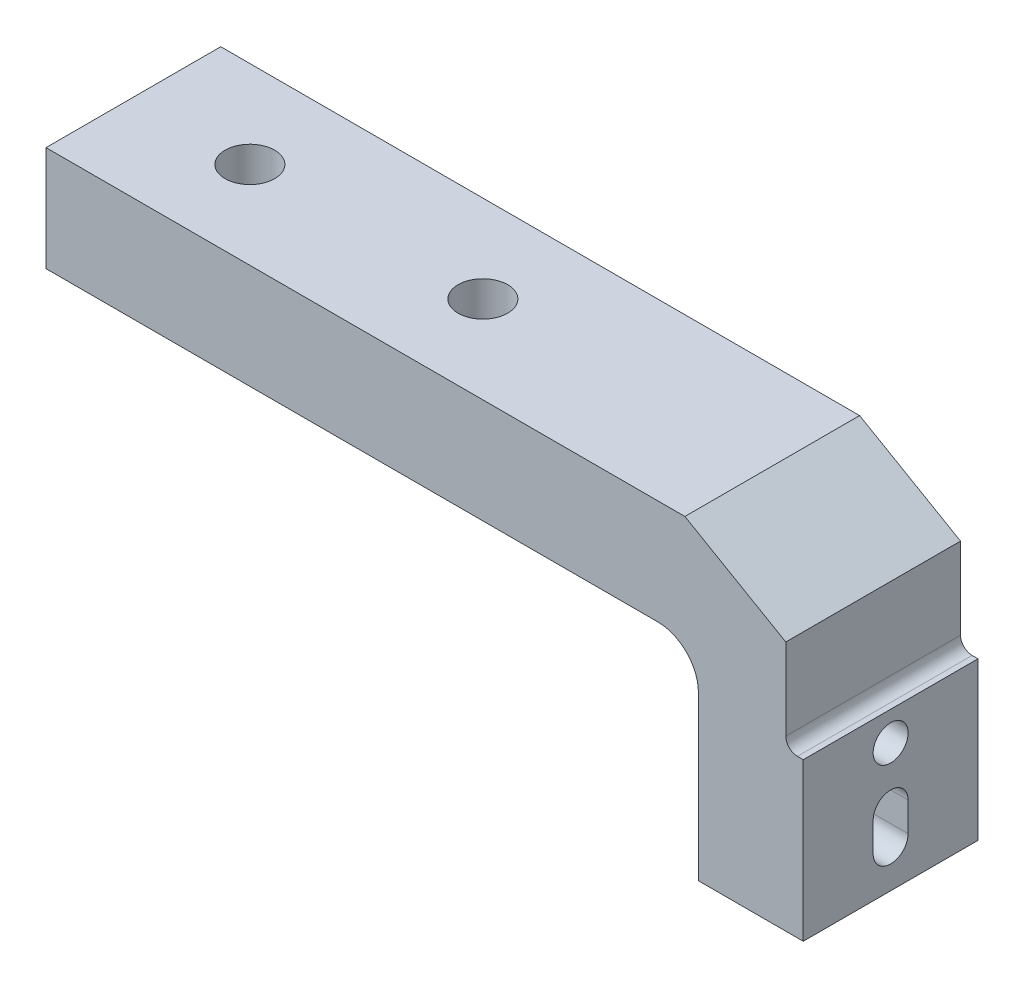
ISO-10303-21;
HEADER;
FILE_DESCRIPTION(('STEP AP214'),'2;1');
FILE_NAME('part.step','',(''),(''),'','','');
FILE_SCHEMA(('AUTOMOTIVE_DESIGN { 1 0 10303 214 1 1 1 1 }'));
ENDSEC;
DATA;
#1=APPLICATION_CONTEXT('core data for automotive mechanical design processes');
#2=APPLICATION_PROTOCOL_DEFINITION('international standard','automotive_design',2000,#1);
#3=PRODUCT_CONTEXT('',#1,'mechanical');
#4=PRODUCT('Part','Part','',(#3));
#5=PRODUCT_RELATED_PRODUCT_CATEGORY('part','',(#4));
#6=PRODUCT_DEFINITION_FORMATION('','',#4);
#7=PRODUCT_DEFINITION_CONTEXT('part definition',#1,'design');
#8=PRODUCT_DEFINITION('design','',#6,#7);
#9=PRODUCT_DEFINITION_SHAPE('','',#8);
#10=(LENGTH_UNIT() NAMED_UNIT(*) SI_UNIT(.MILLI.,.METRE.));
#11=(NAMED_UNIT(*) PLANE_ANGLE_UNIT() SI_UNIT($,.RADIAN.));
#12=(NAMED_UNIT(*) SI_UNIT($,.STERADIAN.) SOLID_ANGLE_UNIT());
#13=UNCERTAINTY_MEASURE_WITH_UNIT(LENGTH_MEASURE(1.E-05),#10,'distance_accuracy_value','');
#14=(GEOMETRIC_REPRESENTATION_CONTEXT(3) GLOBAL_UNCERTAINTY_ASSIGNED_CONTEXT((#13)) GLOBAL_UNIT_ASSIGNED_CONTEXT((#10,
#11,#12)) REPRESENTATION_CONTEXT('',''));
#15=CARTESIAN_POINT('',(0.,0.,0.));
#16=DIRECTION('',(0.,0.,1.));
#17=DIRECTION('',(1.,0.,0.));
#18=AXIS2_PLACEMENT_3D('',#15,#16,#17);
#19=CARTESIAN_POINT('',(-18.,0.,15.));
#20=DIRECTION('',(0.,1.,0.));
#21=DIRECTION('',(0.,0.,1.));
#22=AXIS2_PLACEMENT_3D('',#19,#20,#21);
#23=PLANE('',#22);
#24=DIRECTION('',(1.,0.,0.));
#25=VECTOR('',#24,1.);
#26=CARTESIAN_POINT('',(-18.,0.,-15.));
#27=LINE('',#26,#25);
#28=CARTESIAN_POINT('',(-18.,0.,-15.));
#29=VERTEX_POINT('',#28);
#30=CARTESIAN_POINT('',(0.,0.,-15.));
#31=VERTEX_POINT('',#30);
#32=EDGE_CURVE('E206',#29,#31,#27,.T.);
#33=ORIENTED_EDGE('',*,*,#32,.T.);
#34=DIRECTION('',(0.,0.,-1.));
#35=VECTOR('',#34,1.);
#36=CARTESIAN_POINT('',(0.,0.,15.));
#37=LINE('',#36,#35);
#38=CARTESIAN_POINT('',(0.,0.,15.));
#39=VERTEX_POINT('',#38);
#40=EDGE_CURVE('E235',#39,#31,#37,.T.);
#41=ORIENTED_EDGE('',*,*,#40,.F.);
#42=DIRECTION('',(1.,0.,0.));
#43=VECTOR('',#42,1.);
#44=CARTESIAN_POINT('',(-18.,0.,15.));
#45=LINE('',#44,#43);
#46=CARTESIAN_POINT('',(-18.,0.,15.));
#47=VERTEX_POINT('',#46);
#48=EDGE_CURVE('E186',#47,#39,#45,.T.);
#49=ORIENTED_EDGE('',*,*,#48,.F.);
#50=DIRECTION('',(0.,0.,-1.));
#51=VECTOR('',#50,1.);
#52=CARTESIAN_POINT('',(-18.,0.,15.));
#53=LINE('',#52,#51);
#54=EDGE_CURVE('E205',#47,#29,#53,.T.);
#55=ORIENTED_EDGE('',*,*,#54,.T.);
#56=EDGE_LOOP('',(#33,#41,#49,#55));
#57=FACE_BOUND('',#56,.T.);
#58=ADVANCED_FACE('F35',(#57),#23,.F.);
#59=CARTESIAN_POINT('',(0.,0.,15.));
#60=DIRECTION('',(-1.,0.,0.));
#61=DIRECTION('',(0.,0.,1.));
#62=AXIS2_PLACEMENT_3D('',#59,#60,#61);
#63=PLANE('',#62);
#64=CARTESIAN_POINT('',(0.,22.,0.));
#65=DIRECTION('',(1.,0.,0.));
#66=DIRECTION('',(0.,0.,-1.));
#67=AXIS2_PLACEMENT_3D('',#64,#65,#66);
#68=CIRCLE('',#67,3.);
#69=CARTESIAN_POINT('',(0.,22.,-3.));
#70=VERTEX_POINT('',#69);
#71=EDGE_CURVE('E162',#70,#70,#68,.T.);
#72=ORIENTED_EDGE('',*,*,#71,.F.);
#73=EDGE_LOOP('',(#72));
#74=FACE_BOUND('',#73,.T.);
#75=DIRECTION('',(0.,-1.,0.));
#76=VECTOR('',#75,1.);
#77=CARTESIAN_POINT('',(0.,12.,3.));
#78=LINE('',#77,#76);
#79=CARTESIAN_POINT('',(0.,12.,3.));
#80=VERTEX_POINT('',#79);
#81=CARTESIAN_POINT('',(0.,7.,3.));
#82=VERTEX_POINT('',#81);
#83=EDGE_CURVE('E170',#80,#82,#78,.T.);
#84=ORIENTED_EDGE('',*,*,#83,.F.);
#85=CARTESIAN_POINT('',(0.,12.,0.));
#86=DIRECTION('',(1.,0.,0.));
#87=DIRECTION('',(0.,0.,-1.));
#88=AXIS2_PLACEMENT_3D('',#85,#86,#87);
#89=CIRCLE('',#88,3.);
#90=CARTESIAN_POINT('',(0.,12.,-3.));
#91=VERTEX_POINT('',#90);
#92=EDGE_CURVE('E149',#91,#80,#89,.T.);
#93=ORIENTED_EDGE('',*,*,#92,.F.);
#94=DIRECTION('',(0.,1.,0.));
#95=VECTOR('',#94,1.);
#96=CARTESIAN_POINT('',(0.,12.,-3.));
#97=LINE('',#96,#95);
#98=CARTESIAN_POINT('',(0.,7.,-3.));
#99=VERTEX_POINT('',#98);
#100=EDGE_CURVE('E154',#99,#91,#97,.T.);
#101=ORIENTED_EDGE('',*,*,#100,.F.);
#102=CARTESIAN_POINT('',(0.,7.,0.));
#103=DIRECTION('',(1.,0.,0.));
#104=DIRECTION('',(0.,0.,-1.));
#105=AXIS2_PLACEMENT_3D('',#102,#103,#104);
#106=CIRCLE('',#105,3.);
#107=EDGE_CURVE('E177',#82,#99,#106,.T.);
#108=ORIENTED_EDGE('',*,*,#107,.F.);
#109=EDGE_LOOP('',(#84,#93,#101,#108));
#110=FACE_BOUND('',#109,.T.);
#111=DIRECTION('',(0.,1.,0.));
#112=VECTOR('',#111,1.);
#113=CARTESIAN_POINT('',(0.,0.,-15.));
#114=LINE('',#113,#112);
#115=CARTESIAN_POINT('',(0.,27.,-15.));
#116=VERTEX_POINT('',#115);
#117=EDGE_CURVE('E209',#31,#116,#114,.T.);
#118=ORIENTED_EDGE('',*,*,#117,.T.);
#119=DIRECTION('',(0.,0.,-1.));
#120=VECTOR('',#119,1.);
#121=CARTESIAN_POINT('',(0.,27.,15.));
#122=LINE('',#121,#120);
#123=CARTESIAN_POINT('',(0.,27.,15.));
#124=VERTEX_POINT('',#123);
#125=EDGE_CURVE('E232',#124,#116,#122,.T.);
#126=ORIENTED_EDGE('',*,*,#125,.F.);
#127=DIRECTION('',(0.,1.,0.));
#128=VECTOR('',#127,1.);
#129=CARTESIAN_POINT('',(0.,0.,15.));
#130=LINE('',#129,#128);
#131=EDGE_CURVE('E189',#39,#124,#130,.T.);
#132=ORIENTED_EDGE('',*,*,#131,.F.);
#133=ORIENTED_EDGE('',*,*,#40,.T.);
#134=EDGE_LOOP('',(#118,#126,#132,#133));
#135=FACE_BOUND('',#134,.T.);
#136=ADVANCED_FACE('F302',(#74,#110,#135),#63,.F.);
#137=CARTESIAN_POINT('',(0.,27.,15.));
#138=DIRECTION('',(0.,-1.,0.));
#139=DIRECTION('',(0.,0.,-1.));
#140=AXIS2_PLACEMENT_3D('',#137,#138,#139);
#141=PLANE('',#140);
#142=DIRECTION('',(-1.,0.,0.));
#143=VECTOR('',#142,1.);
#144=CARTESIAN_POINT('',(0.,27.,-15.));
#145=LINE('',#144,#143);
#146=CARTESIAN_POINT('',(-1.,27.,-15.));
#147=VERTEX_POINT('',#146);
#148=EDGE_CURVE('E212',#116,#147,#145,.T.);
#149=ORIENTED_EDGE('',*,*,#148,.T.);
#150=DIRECTION('',(0.,0.,-1.));
#151=VECTOR('',#150,1.);
#152=CARTESIAN_POINT('',(-1.,27.,15.));
#153=LINE('',#152,#151);
#154=CARTESIAN_POINT('',(-1.,27.,15.));
#155=VERTEX_POINT('',#154);
#156=EDGE_CURVE('E50',#147,#155,#153,.F.);
#157=ORIENTED_EDGE('',*,*,#156,.T.);
#158=DIRECTION('',(-1.,0.,0.));
#159=VECTOR('',#158,1.);
#160=CARTESIAN_POINT('',(0.,27.,15.));
#161=LINE('',#160,#159);
#162=EDGE_CURVE('E192',#124,#155,#161,.T.);
#163=ORIENTED_EDGE('',*,*,#162,.F.);
#164=ORIENTED_EDGE('',*,*,#125,.T.);
#165=EDGE_LOOP('',(#149,#157,#163,#164));
#166=FACE_BOUND('',#165,.T.);
#167=ADVANCED_FACE('F303',(#166),#141,.F.);
#168=CARTESIAN_POINT('',(-3.,27.,15.));
#169=DIRECTION('',(-1.,0.,0.));
#170=DIRECTION('',(0.,0.,1.));
#171=AXIS2_PLACEMENT_3D('',#168,#169,#170);
#172=PLANE('',#171);
#173=DIRECTION('',(0.,1.,0.));
#174=VECTOR('',#173,1.);
#175=CARTESIAN_POINT('',(-3.,27.,15.));
#176=LINE('',#175,#174);
#177=CARTESIAN_POINT('',(-3.,29.,15.));
#178=VERTEX_POINT('',#177);
#179=CARTESIAN_POINT('',(-3.,43.,15.));
#180=VERTEX_POINT('',#179);
#181=EDGE_CURVE('E194',#178,#180,#176,.T.);
#182=ORIENTED_EDGE('',*,*,#181,.F.);
#183=DIRECTION('',(0.,0.,-1.));
#184=VECTOR('',#183,1.);
#185=CARTESIAN_POINT('',(-3.,29.,-15.));
#186=LINE('',#185,#184);
#187=CARTESIAN_POINT('',(-3.,29.,-15.));
#188=VERTEX_POINT('',#187);
#189=EDGE_CURVE('E258',#178,#188,#186,.T.);
#190=ORIENTED_EDGE('',*,*,#189,.T.);
#191=DIRECTION('',(0.,1.,0.));
#192=VECTOR('',#191,1.);
#193=CARTESIAN_POINT('',(-3.,27.,-15.));
#194=LINE('',#193,#192);
#195=CARTESIAN_POINT('',(-3.,43.,-15.));
#196=VERTEX_POINT('',#195);
#197=EDGE_CURVE('E214',#188,#196,#194,.T.);
#198=ORIENTED_EDGE('',*,*,#197,.T.);
#199=DIRECTION('',(0.,0.,1.));
#200=VECTOR('',#199,1.);
#201=CARTESIAN_POINT('',(-3.,43.,15.));
#202=LINE('',#201,#200);
#203=EDGE_CURVE('E253',#196,#180,#202,.T.);
#204=ORIENTED_EDGE('',*,*,#203,.T.);
#205=EDGE_LOOP('',(#182,#190,#198,#204));
#206=FACE_BOUND('',#205,.T.);
#207=ADVANCED_FACE('F264',(#206),#172,.F.);
#208=CARTESIAN_POINT('',(-3.,53.,15.));
#209=DIRECTION('',(0.,-1.,0.));
#210=DIRECTION('',(1.,0.,0.));
#211=AXIS2_PLACEMENT_3D('',#208,#209,#210);
#212=PLANE('',#211);
#213=CARTESIAN_POINT('',(-110.,53.,0.));
#214=DIRECTION('',(0.,-1.,0.));
#215=DIRECTION('',(1.,0.,0.));
#216=AXIS2_PLACEMENT_3D('',#213,#214,#215);
#217=CIRCLE('',#216,4.25000000000001);
#218=CARTESIAN_POINT('',(-105.75,53.,0.));
#219=VERTEX_POINT('',#218);
#220=EDGE_CURVE('E477',#219,#219,#217,.T.);
#221=ORIENTED_EDGE('',*,*,#220,.T.);
#222=EDGE_LOOP('',(#221));
#223=FACE_BOUND('',#222,.T.);
#224=CARTESIAN_POINT('',(-70.,53.,0.));
#225=DIRECTION('',(0.,-1.,0.));
#226=DIRECTION('',(1.,0.,0.));
#227=AXIS2_PLACEMENT_3D('',#224,#225,#226);
#228=CIRCLE('',#227,4.25000000000001);
#229=CARTESIAN_POINT('',(-65.75,53.,0.));
#230=VERTEX_POINT('',#229);
#231=EDGE_CURVE('E479',#230,#230,#228,.T.);
#232=ORIENTED_EDGE('',*,*,#231,.T.);
#233=EDGE_LOOP('',(#232));
#234=FACE_BOUND('',#233,.T.);
#235=DIRECTION('',(-1.,0.,0.));
#236=VECTOR('',#235,1.);
#237=CARTESIAN_POINT('',(-3.,53.,15.));
#238=LINE('',#237,#236);
#239=CARTESIAN_POINT('',(-20.3205080756887,53.,15.));
#240=VERTEX_POINT('',#239);
#241=CARTESIAN_POINT('',(-130.,53.,15.));
#242=VERTEX_POINT('',#241);
#243=EDGE_CURVE('E196',#240,#242,#238,.T.);
#244=ORIENTED_EDGE('',*,*,#243,.F.);
#245=DIRECTION('',(0.,0.,-1.));
#246=VECTOR('',#245,1.);
#247=CARTESIAN_POINT('',(-20.3205080756887,53.,15.));
#248=LINE('',#247,#246);
#249=CARTESIAN_POINT('',(-20.3205080756887,53.,-15.));
#250=VERTEX_POINT('',#249);
#251=EDGE_CURVE('E247',#240,#250,#248,.T.);
#252=ORIENTED_EDGE('',*,*,#251,.T.);
#253=DIRECTION('',(-1.,0.,0.));
#254=VECTOR('',#253,1.);
#255=CARTESIAN_POINT('',(-3.,53.,-15.));
#256=LINE('',#255,#254);
#257=CARTESIAN_POINT('',(-130.,53.,-15.));
#258=VERTEX_POINT('',#257);
#259=EDGE_CURVE('E216',#250,#258,#256,.T.);
#260=ORIENTED_EDGE('',*,*,#259,.T.);
#261=DIRECTION('',(0.,0.,-1.));
#262=VECTOR('',#261,1.);
#263=CARTESIAN_POINT('',(-130.,53.,15.));
#264=LINE('',#263,#262);
#265=EDGE_CURVE('E229',#242,#258,#264,.T.);
#266=ORIENTED_EDGE('',*,*,#265,.F.);
#267=EDGE_LOOP('',(#244,#252,#260,#266));
#268=FACE_BOUND('',#267,.T.);
#269=ADVANCED_FACE('F280',(#223,#234,#268),#212,.F.);
#270=CARTESIAN_POINT('',(-130.,53.,15.));
#271=DIRECTION('',(1.,0.,0.));
#272=DIRECTION('',(0.,0.,-1.));
#273=AXIS2_PLACEMENT_3D('',#270,#271,#272);
#274=PLANE('',#273);
#275=DIRECTION('',(0.,-1.,0.));
#276=VECTOR('',#275,1.);
#277=CARTESIAN_POINT('',(-130.,53.,-15.));
#278=LINE('',#277,#276);
#279=CARTESIAN_POINT('',(-130.,35.,-15.));
#280=VERTEX_POINT('',#279);
#281=EDGE_CURVE('E218',#258,#280,#278,.T.);
#282=ORIENTED_EDGE('',*,*,#281,.T.);
#283=DIRECTION('',(0.,0.,-1.));
#284=VECTOR('',#283,1.);
#285=CARTESIAN_POINT('',(-130.,35.,15.));
#286=LINE('',#285,#284);
#287=CARTESIAN_POINT('',(-130.,35.,15.));
#288=VERTEX_POINT('',#287);
#289=EDGE_CURVE('E226',#288,#280,#286,.T.);
#290=ORIENTED_EDGE('',*,*,#289,.F.);
#291=DIRECTION('',(0.,-1.,0.));
#292=VECTOR('',#291,1.);
#293=CARTESIAN_POINT('',(-130.,53.,15.));
#294=LINE('',#293,#292);
#295=EDGE_CURVE('E198',#242,#288,#294,.T.);
#296=ORIENTED_EDGE('',*,*,#295,.F.);
#297=ORIENTED_EDGE('',*,*,#265,.T.);
#298=EDGE_LOOP('',(#282,#290,#296,#297));
#299=FACE_BOUND('',#298,.T.);
#300=ADVANCED_FACE('F284',(#299),#274,.F.);
#301=CARTESIAN_POINT('',(-130.,35.,15.));
#302=DIRECTION('',(0.,1.,0.));
#303=DIRECTION('',(0.,0.,1.));
#304=AXIS2_PLACEMENT_3D('',#301,#302,#303);
#305=PLANE('',#304);
#306=CARTESIAN_POINT('',(-110.,35.,0.));
#307=DIRECTION('',(0.,-1.,0.));
#308=DIRECTION('',(0.,0.,-1.));
#309=AXIS2_PLACEMENT_3D('',#306,#307,#308);
#310=CIRCLE('',#309,4.25000000000001);
#311=CARTESIAN_POINT('',(-110.,35.,-4.25000000000002));
#312=VERTEX_POINT('',#311);
#313=EDGE_CURVE('E488',#312,#312,#310,.T.);
#314=ORIENTED_EDGE('',*,*,#313,.F.);
#315=EDGE_LOOP('',(#314));
#316=FACE_BOUND('',#315,.T.);
#317=CARTESIAN_POINT('',(-70.,35.,0.));
#318=DIRECTION('',(0.,-1.,0.));
#319=DIRECTION('',(0.,0.,-1.));
#320=AXIS2_PLACEMENT_3D('',#317,#318,#319);
#321=CIRCLE('',#320,4.25000000000001);
#322=CARTESIAN_POINT('',(-70.,35.,-4.25000000000001));
#323=VERTEX_POINT('',#322);
#324=EDGE_CURVE('E489',#323,#323,#321,.T.);
#325=ORIENTED_EDGE('',*,*,#324,.F.);
#326=EDGE_LOOP('',(#325));
#327=FACE_BOUND('',#326,.T.);
#328=DIRECTION('',(1.,0.,0.));
#329=VECTOR('',#328,1.);
#330=CARTESIAN_POINT('',(-130.,35.,-15.));
#331=LINE('',#330,#329);
#332=CARTESIAN_POINT('',(-25.,35.,-15.));
#333=VERTEX_POINT('',#332);
#334=EDGE_CURVE('E220',#280,#333,#331,.T.);
#335=ORIENTED_EDGE('',*,*,#334,.T.);
#336=DIRECTION('',(0.,0.,-1.));
#337=VECTOR('',#336,1.);
#338=CARTESIAN_POINT('',(-25.,35.,15.));
#339=LINE('',#338,#337);
#340=CARTESIAN_POINT('',(-25.,35.,15.));
#341=VERTEX_POINT('',#340);
#342=EDGE_CURVE('E241',#333,#341,#339,.F.);
#343=ORIENTED_EDGE('',*,*,#342,.T.);
#344=DIRECTION('',(1.,0.,0.));
#345=VECTOR('',#344,1.);
#346=CARTESIAN_POINT('',(-130.,35.,15.));
#347=LINE('',#346,#345);
#348=EDGE_CURVE('E200',#288,#341,#347,.T.);
#349=ORIENTED_EDGE('',*,*,#348,.F.);
#350=ORIENTED_EDGE('',*,*,#289,.T.);
#351=EDGE_LOOP('',(#335,#343,#349,#350));
#352=FACE_BOUND('',#351,.T.);
#353=ADVANCED_FACE('F387',(#316,#327,#352),#305,.F.);
#354=CARTESIAN_POINT('',(-18.,35.,15.));
#355=DIRECTION('',(1.,0.,0.));
#356=DIRECTION('',(0.,1.,0.));
#357=AXIS2_PLACEMENT_3D('',#354,#355,#356);
#358=PLANE('',#357);
#359=CARTESIAN_POINT('',(-18.,22.,0.));
#360=DIRECTION('',(1.,0.,0.));
#361=DIRECTION('',(0.,1.,0.));
#362=AXIS2_PLACEMENT_3D('',#359,#360,#361);
#363=CIRCLE('',#362,3.);
#364=CARTESIAN_POINT('',(-18.,25.,0.));
#365=VERTEX_POINT('',#364);
#366=EDGE_CURVE('E210',#365,#365,#363,.F.);
#367=ORIENTED_EDGE('',*,*,#366,.F.);
#368=EDGE_LOOP('',(#367));
#369=FACE_BOUND('',#368,.T.);
#370=DIRECTION('',(0.,-1.,0.));
#371=VECTOR('',#370,1.);
#372=CARTESIAN_POINT('',(-18.,12.,-3.));
#373=LINE('',#372,#371);
#374=CARTESIAN_POINT('',(-18.,12.,-3.));
#375=VERTEX_POINT('',#374);
#376=CARTESIAN_POINT('',(-18.,7.,-3.));
#377=VERTEX_POINT('',#376);
#378=EDGE_CURVE('E168',#375,#377,#373,.T.);
#379=ORIENTED_EDGE('',*,*,#378,.F.);
#380=CARTESIAN_POINT('',(-18.,12.,0.));
#381=DIRECTION('',(1.,0.,0.));
#382=DIRECTION('',(0.,1.,0.));
#383=AXIS2_PLACEMENT_3D('',#380,#381,#382);
#384=CIRCLE('',#383,3.);
#385=CARTESIAN_POINT('',(-18.,12.,3.));
#386=VERTEX_POINT('',#385);
#387=EDGE_CURVE('E146',#386,#375,#384,.F.);
#388=ORIENTED_EDGE('',*,*,#387,.F.);
#389=DIRECTION('',(0.,1.,0.));
#390=VECTOR('',#389,1.);
#391=CARTESIAN_POINT('',(-18.,12.,3.));
#392=LINE('',#391,#390);
#393=CARTESIAN_POINT('',(-18.,7.,3.));
#394=VERTEX_POINT('',#393);
#395=EDGE_CURVE('E158',#394,#386,#392,.T.);
#396=ORIENTED_EDGE('',*,*,#395,.F.);
#397=CARTESIAN_POINT('',(-18.,7.,0.));
#398=DIRECTION('',(1.,0.,0.));
#399=DIRECTION('',(0.,1.,0.));
#400=AXIS2_PLACEMENT_3D('',#397,#398,#399);
#401=CIRCLE('',#400,3.);
#402=EDGE_CURVE('E172',#377,#394,#401,.F.);
#403=ORIENTED_EDGE('',*,*,#402,.F.);
#404=EDGE_LOOP('',(#379,#388,#396,#403));
#405=FACE_BOUND('',#404,.T.);
#406=DIRECTION('',(0.,-1.,0.));
#407=VECTOR('',#406,1.);
#408=CARTESIAN_POINT('',(-18.,35.,15.));
#409=LINE('',#408,#407);
#410=CARTESIAN_POINT('',(-18.,28.,15.));
#411=VERTEX_POINT('',#410);
#412=EDGE_CURVE('E203',#411,#47,#409,.T.);
#413=ORIENTED_EDGE('',*,*,#412,.F.);
#414=DIRECTION('',(0.,0.,-1.));
#415=VECTOR('',#414,1.);
#416=CARTESIAN_POINT('',(-18.,28.,-15.));
#417=LINE('',#416,#415);
#418=CARTESIAN_POINT('',(-18.,28.,-15.));
#419=VERTEX_POINT('',#418);
#420=EDGE_CURVE('E238',#411,#419,#417,.T.);
#421=ORIENTED_EDGE('',*,*,#420,.T.);
#422=DIRECTION('',(0.,-1.,0.));
#423=VECTOR('',#422,1.);
#424=CARTESIAN_POINT('',(-18.,35.,-15.));
#425=LINE('',#424,#423);
#426=EDGE_CURVE('E190',#419,#29,#425,.T.);
#427=ORIENTED_EDGE('',*,*,#426,.T.);
#428=ORIENTED_EDGE('',*,*,#54,.F.);
#429=EDGE_LOOP('',(#413,#421,#427,#428));
#430=FACE_BOUND('',#429,.T.);
#431=ADVANCED_FACE('F165',(#369,#405,#430),#358,.F.);
#432=CARTESIAN_POINT('',(0.,0.,15.));
#433=DIRECTION('',(0.,0.,1.));
#434=DIRECTION('',(1.,0.,0.));
#435=AXIS2_PLACEMENT_3D('',#432,#433,#434);
#436=PLANE('',#435);
#437=ORIENTED_EDGE('',*,*,#162,.T.);
#438=CARTESIAN_POINT('',(-1.,29.,15.));
#439=DIRECTION('',(0.,0.,1.));
#440=DIRECTION('',(1.,0.,0.));
#441=AXIS2_PLACEMENT_3D('',#438,#439,#440);
#442=CIRCLE('',#441,2.);
#443=EDGE_CURVE('E11',#155,#178,#442,.F.);
#444=ORIENTED_EDGE('',*,*,#443,.T.);
#445=ORIENTED_EDGE('',*,*,#181,.T.);
#446=DIRECTION('',(0.866025403784438,-0.500000000000001,0.));
#447=VECTOR('',#446,1.);
#448=CARTESIAN_POINT('',(17.8695461813655,30.9509618943233,15.));
#449=LINE('',#448,#447);
#450=EDGE_CURVE('E256',#180,#240,#449,.F.);
#451=ORIENTED_EDGE('',*,*,#450,.T.);
#452=ORIENTED_EDGE('',*,*,#243,.T.);
#453=ORIENTED_EDGE('',*,*,#295,.T.);
#454=ORIENTED_EDGE('',*,*,#348,.T.);
#455=CARTESIAN_POINT('',(-25.,28.,15.));
#456=DIRECTION('',(0.,0.,1.));
#457=DIRECTION('',(1.,0.,0.));
#458=AXIS2_PLACEMENT_3D('',#455,#456,#457);
#459=CIRCLE('',#458,7.);
#460=EDGE_CURVE('E245',#341,#411,#459,.F.);
#461=ORIENTED_EDGE('',*,*,#460,.T.);
#462=ORIENTED_EDGE('',*,*,#412,.T.);
#463=ORIENTED_EDGE('',*,*,#48,.T.);
#464=ORIENTED_EDGE('',*,*,#131,.T.);
#465=EDGE_LOOP('',(#437,#444,#445,#451,#452,#453,#454,#461,#462,#463,#464));
#466=FACE_BOUND('',#465,.T.);
#467=ADVANCED_FACE('F277',(#466),#436,.T.);
#468=CARTESIAN_POINT('',(0.,0.,-15.));
#469=DIRECTION('',(0.,0.,1.));
#470=DIRECTION('',(1.,0.,0.));
#471=AXIS2_PLACEMENT_3D('',#468,#469,#470);
#472=PLANE('',#471);
#473=ORIENTED_EDGE('',*,*,#259,.F.);
#474=DIRECTION('',(-0.866025403784438,0.500000000000001,0.));
#475=VECTOR('',#474,1.);
#476=CARTESIAN_POINT('',(-20.3205080756887,53.,-15.));
#477=LINE('',#476,#475);
#478=EDGE_CURVE('E250',#250,#196,#477,.F.);
#479=ORIENTED_EDGE('',*,*,#478,.T.);
#480=ORIENTED_EDGE('',*,*,#197,.F.);
#481=CARTESIAN_POINT('',(-1.,29.,-15.));
#482=DIRECTION('',(0.,0.,1.));
#483=DIRECTION('',(1.,0.,0.));
#484=AXIS2_PLACEMENT_3D('',#481,#482,#483);
#485=CIRCLE('',#484,2.);
#486=EDGE_CURVE('E43',#188,#147,#485,.T.);
#487=ORIENTED_EDGE('',*,*,#486,.T.);
#488=ORIENTED_EDGE('',*,*,#148,.F.);
#489=ORIENTED_EDGE('',*,*,#117,.F.);
#490=ORIENTED_EDGE('',*,*,#32,.F.);
#491=ORIENTED_EDGE('',*,*,#426,.F.);
#492=CARTESIAN_POINT('',(-25.,28.,-15.));
#493=DIRECTION('',(0.,0.,1.));
#494=DIRECTION('',(1.,0.,0.));
#495=AXIS2_PLACEMENT_3D('',#492,#493,#494);
#496=CIRCLE('',#495,7.);
#497=EDGE_CURVE('E243',#419,#333,#496,.T.);
#498=ORIENTED_EDGE('',*,*,#497,.T.);
#499=ORIENTED_EDGE('',*,*,#334,.F.);
#500=ORIENTED_EDGE('',*,*,#281,.F.);
#501=EDGE_LOOP('',(#473,#479,#480,#487,#488,#489,#490,#491,#498,#499,#500));
#502=FACE_BOUND('',#501,.T.);
#503=ADVANCED_FACE('F268',(#502),#472,.F.);
#504=CARTESIAN_POINT('',(-130.001,12.,0.));
#505=DIRECTION('',(1.,0.,0.));
#506=DIRECTION('',(0.,0.,-1.));
#507=AXIS2_PLACEMENT_3D('',#504,#505,#506);
#508=CYLINDRICAL_SURFACE('',#507,3.);
#509=ORIENTED_EDGE('',*,*,#387,.T.);
#510=DIRECTION('',(1.,0.,0.));
#511=VECTOR('',#510,1.);
#512=CARTESIAN_POINT('',(-130.001,12.,-3.));
#513=LINE('',#512,#511);
#514=EDGE_CURVE('E163',#375,#91,#513,.T.);
#515=ORIENTED_EDGE('',*,*,#514,.T.);
#516=ORIENTED_EDGE('',*,*,#92,.T.);
#517=DIRECTION('',(1.,0.,0.));
#518=VECTOR('',#517,1.);
#519=CARTESIAN_POINT('',(-130.001,12.,3.));
#520=LINE('',#519,#518);
#521=EDGE_CURVE('E142',#386,#80,#520,.T.);
#522=ORIENTED_EDGE('',*,*,#521,.F.);
#523=EDGE_LOOP('',(#509,#515,#516,#522));
#524=FACE_BOUND('',#523,.T.);
#525=ADVANCED_FACE('F144',(#524),#508,.F.);
#526=CARTESIAN_POINT('',(-130.001,12.,-3.));
#527=DIRECTION('',(0.,0.,-1.));
#528=DIRECTION('',(-1.,0.,0.));
#529=AXIS2_PLACEMENT_3D('',#526,#527,#528);
#530=PLANE('',#529);
#531=ORIENTED_EDGE('',*,*,#378,.T.);
#532=DIRECTION('',(1.,0.,0.));
#533=VECTOR('',#532,1.);
#534=CARTESIAN_POINT('',(-130.001,7.,-3.));
#535=LINE('',#534,#533);
#536=EDGE_CURVE('E183',#377,#99,#535,.T.);
#537=ORIENTED_EDGE('',*,*,#536,.T.);
#538=ORIENTED_EDGE('',*,*,#100,.T.);
#539=ORIENTED_EDGE('',*,*,#514,.F.);
#540=EDGE_LOOP('',(#531,#537,#538,#539));
#541=FACE_BOUND('',#540,.T.);
#542=ADVANCED_FACE('F442',(#541),#530,.F.);
#543=CARTESIAN_POINT('',(-130.001,7.,0.));
#544=DIRECTION('',(1.,0.,0.));
#545=DIRECTION('',(0.,0.,-1.));
#546=AXIS2_PLACEMENT_3D('',#543,#544,#545);
#547=CYLINDRICAL_SURFACE('',#546,3.);
#548=ORIENTED_EDGE('',*,*,#402,.T.);
#549=DIRECTION('',(1.,0.,0.));
#550=VECTOR('',#549,1.);
#551=CARTESIAN_POINT('',(-130.001,7.,3.));
#552=LINE('',#551,#550);
#553=EDGE_CURVE('E153',#394,#82,#552,.T.);
#554=ORIENTED_EDGE('',*,*,#553,.T.);
#555=ORIENTED_EDGE('',*,*,#107,.T.);
#556=ORIENTED_EDGE('',*,*,#536,.F.);
#557=EDGE_LOOP('',(#548,#554,#555,#556));
#558=FACE_BOUND('',#557,.T.);
#559=ADVANCED_FACE('F433',(#558),#547,.F.);
#560=CARTESIAN_POINT('',(-130.001,12.,3.));
#561=DIRECTION('',(0.,0.,1.));
#562=DIRECTION('',(0.,-1.,0.));
#563=AXIS2_PLACEMENT_3D('',#560,#561,#562);
#564=PLANE('',#563);
#565=ORIENTED_EDGE('',*,*,#395,.T.);
#566=ORIENTED_EDGE('',*,*,#521,.T.);
#567=ORIENTED_EDGE('',*,*,#83,.T.);
#568=ORIENTED_EDGE('',*,*,#553,.F.);
#569=EDGE_LOOP('',(#565,#566,#567,#568));
#570=FACE_BOUND('',#569,.T.);
#571=ADVANCED_FACE('F159',(#570),#564,.F.);
#572=CARTESIAN_POINT('',(-130.001,22.,0.));
#573=DIRECTION('',(1.,0.,0.));
#574=DIRECTION('',(0.,0.,-1.));
#575=AXIS2_PLACEMENT_3D('',#572,#573,#574);
#576=CYLINDRICAL_SURFACE('',#575,3.);
#577=ORIENTED_EDGE('',*,*,#71,.T.);
#578=EDGE_LOOP('',(#577));
#579=FACE_BOUND('',#578,.T.);
#580=ORIENTED_EDGE('',*,*,#366,.T.);
#581=EDGE_LOOP('',(#580));
#582=FACE_BOUND('',#581,.T.);
#583=ADVANCED_FACE('F414',(#579,#582),#576,.F.);
#584=CARTESIAN_POINT('',(-70.,65.,0.));
#585=DIRECTION('',(0.,-1.,0.));
#586=DIRECTION('',(0.,0.,-1.));
#587=AXIS2_PLACEMENT_3D('',#584,#585,#586);
#588=CYLINDRICAL_SURFACE('',#587,4.25000000000001);
#589=ORIENTED_EDGE('',*,*,#324,.T.);
#590=EDGE_LOOP('',(#589));
#591=FACE_BOUND('',#590,.T.);
#592=ORIENTED_EDGE('',*,*,#231,.F.);
#593=EDGE_LOOP('',(#592));
#594=FACE_BOUND('',#593,.T.);
#595=ADVANCED_FACE('F404',(#591,#594),#588,.F.);
#596=CARTESIAN_POINT('',(-110.,65.,0.));
#597=DIRECTION('',(0.,-1.,0.));
#598=DIRECTION('',(0.,0.,-1.));
#599=AXIS2_PLACEMENT_3D('',#596,#597,#598);
#600=CYLINDRICAL_SURFACE('',#599,4.25000000000001);
#601=ORIENTED_EDGE('',*,*,#313,.T.);
#602=EDGE_LOOP('',(#601));
#603=FACE_BOUND('',#602,.T.);
#604=ORIENTED_EDGE('',*,*,#220,.F.);
#605=EDGE_LOOP('',(#604));
#606=FACE_BOUND('',#605,.T.);
#607=ADVANCED_FACE('F319',(#603,#606),#600,.F.);
#608=CARTESIAN_POINT('',(-25.,28.,15.));
#609=DIRECTION('',(0.,0.,1.));
#610=DIRECTION('',(1.,0.,0.));
#611=AXIS2_PLACEMENT_3D('',#608,#609,#610);
#612=CYLINDRICAL_SURFACE('',#611,7.);
#613=ORIENTED_EDGE('',*,*,#460,.F.);
#614=ORIENTED_EDGE('',*,*,#342,.F.);
#615=ORIENTED_EDGE('',*,*,#497,.F.);
#616=ORIENTED_EDGE('',*,*,#420,.F.);
#617=EDGE_LOOP('',(#613,#614,#615,#616));
#618=FACE_BOUND('',#617,.T.);
#619=ADVANCED_FACE('F292',(#618),#612,.F.);
#620=CARTESIAN_POINT('',(-20.3205080756887,53.,15.));
#621=DIRECTION('',(-0.500000000000001,-0.866025403784438,0.));
#622=DIRECTION('',(0.,0.,-1.));
#623=AXIS2_PLACEMENT_3D('',#620,#621,#622);
#624=PLANE('',#623);
#625=ORIENTED_EDGE('',*,*,#450,.F.);
#626=ORIENTED_EDGE('',*,*,#203,.F.);
#627=ORIENTED_EDGE('',*,*,#478,.F.);
#628=ORIENTED_EDGE('',*,*,#251,.F.);
#629=EDGE_LOOP('',(#625,#626,#627,#628));
#630=FACE_BOUND('',#629,.T.);
#631=ADVANCED_FACE('F274',(#630),#624,.F.);
#632=CARTESIAN_POINT('',(-1.,29.,15.));
#633=DIRECTION('',(0.,0.,1.));
#634=DIRECTION('',(1.,0.,0.));
#635=AXIS2_PLACEMENT_3D('',#632,#633,#634);
#636=CYLINDRICAL_SURFACE('',#635,2.);
#637=ORIENTED_EDGE('',*,*,#443,.F.);
#638=ORIENTED_EDGE('',*,*,#156,.F.);
#639=ORIENTED_EDGE('',*,*,#486,.F.);
#640=ORIENTED_EDGE('',*,*,#189,.F.);
#641=EDGE_LOOP('',(#637,#638,#639,#640));
#642=FACE_BOUND('',#641,.T.);
#643=ADVANCED_FACE('F37',(#642),#636,.F.);
#644=CLOSED_SHELL('',(#58,#136,#167,#207,#269,#300,#353,#431,#467,#503,#525,#542,#559,#571,#583,
#595,#607,#619,#631,#643));
#645=MANIFOLD_SOLID_BREP('B2',#644);
#646=ADVANCED_BREP_SHAPE_REPRESENTATION('',(#18,#645),#14);
#647=SHAPE_DEFINITION_REPRESENTATION(#9,#646);
ENDSEC;
END-ISO-10303-21;
